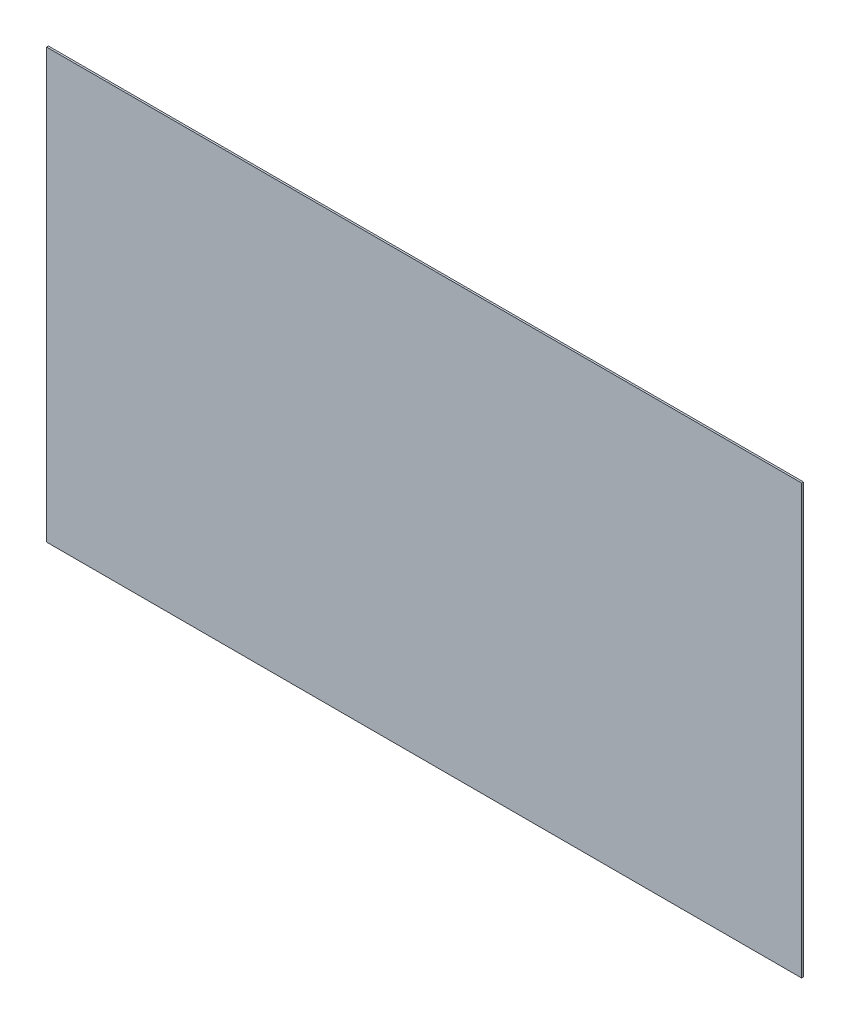
ISO-10303-21;
HEADER;
FILE_DESCRIPTION(('STEP AP214'),'2;1');
FILE_NAME('part.step','',(''),(''),'','','');
FILE_SCHEMA(('AUTOMOTIVE_DESIGN { 1 0 10303 214 1 1 1 1 }'));
ENDSEC;
DATA;
#1=APPLICATION_CONTEXT('core data for automotive mechanical design processes');
#2=APPLICATION_PROTOCOL_DEFINITION('international standard','automotive_design',2000,#1);
#3=PRODUCT_CONTEXT('',#1,'mechanical');
#4=PRODUCT('Part','Part','',(#3));
#5=PRODUCT_RELATED_PRODUCT_CATEGORY('part','',(#4));
#6=PRODUCT_DEFINITION_FORMATION('','',#4);
#7=PRODUCT_DEFINITION_CONTEXT('part definition',#1,'design');
#8=PRODUCT_DEFINITION('design','',#6,#7);
#9=PRODUCT_DEFINITION_SHAPE('','',#8);
#10=(LENGTH_UNIT() NAMED_UNIT(*) SI_UNIT(.MILLI.,.METRE.));
#11=(NAMED_UNIT(*) PLANE_ANGLE_UNIT() SI_UNIT($,.RADIAN.));
#12=(NAMED_UNIT(*) SI_UNIT($,.STERADIAN.) SOLID_ANGLE_UNIT());
#13=UNCERTAINTY_MEASURE_WITH_UNIT(LENGTH_MEASURE(1.E-05),#10,'distance_accuracy_value','');
#14=(GEOMETRIC_REPRESENTATION_CONTEXT(3) GLOBAL_UNCERTAINTY_ASSIGNED_CONTEXT((#13)) GLOBAL_UNIT_ASSIGNED_CONTEXT((#10,
#11,#12)) REPRESENTATION_CONTEXT('',''));
#15=CARTESIAN_POINT('',(0.,0.,0.));
#16=DIRECTION('',(0.,0.,1.));
#17=DIRECTION('',(1.,0.,0.));
#18=AXIS2_PLACEMENT_3D('',#15,#16,#17);
#19=CARTESIAN_POINT('',(0.,0.,4.));
#20=DIRECTION('',(0.,0.,1.));
#21=DIRECTION('',(1.,0.,0.));
#22=AXIS2_PLACEMENT_3D('',#19,#20,#21);
#23=PLANE('',#22);
#24=DIRECTION('',(-1.,0.,0.));
#25=VECTOR('',#24,1.);
#26=CARTESIAN_POINT('',(-400000.,-23.0000000000814,4.));
#27=LINE('',#26,#25);
#28=CARTESIAN_POINT('',(40.5000000000215,-23.0000000000246,4.));
#29=VERTEX_POINT('',#28);
#30=CARTESIAN_POINT('',(-40.4999999999958,-23.0000000000246,4.));
#31=VERTEX_POINT('',#30);
#32=EDGE_CURVE('E41',#29,#31,#27,.T.);
#33=ORIENTED_EDGE('',*,*,#32,.F.);
#34=DIRECTION('',(0.,-1.,0.));
#35=VECTOR('',#34,1.);
#36=CARTESIAN_POINT('',(40.5000000000655,-291545.,4.));
#37=LINE('',#36,#35);
#38=CARTESIAN_POINT('',(40.5000000000655,23.0000000000191,4.));
#39=VERTEX_POINT('',#38);
#40=EDGE_CURVE('E64',#39,#29,#37,.T.);
#41=ORIENTED_EDGE('',*,*,#40,.F.);
#42=DIRECTION('',(1.,0.,0.));
#43=VECTOR('',#42,1.);
#44=CARTESIAN_POINT('',(-400000.,22.9999999999677,4.));
#45=LINE('',#44,#43);
#46=CARTESIAN_POINT('',(-40.5000000000086,23.0000000000191,4.));
#47=VERTEX_POINT('',#46);
#48=EDGE_CURVE('E69',#47,#39,#45,.T.);
#49=ORIENTED_EDGE('',*,*,#48,.F.);
#50=DIRECTION('',(0.,1.,0.));
#51=VECTOR('',#50,1.);
#52=CARTESIAN_POINT('',(-40.4999999999518,-291545.,4.));
#53=LINE('',#52,#51);
#54=EDGE_CURVE('E84',#31,#47,#53,.T.);
#55=ORIENTED_EDGE('',*,*,#54,.F.);
#56=EDGE_LOOP('',(#33,#41,#49,#55));
#57=FACE_BOUND('',#56,.T.);
#58=ADVANCED_FACE('F33',(#57),#23,.T.);
#59=CARTESIAN_POINT('',(0.,0.,3.8));
#60=DIRECTION('',(0.,0.,-1.));
#61=DIRECTION('',(-1.,0.,0.));
#62=AXIS2_PLACEMENT_3D('',#59,#60,#61);
#63=PLANE('',#62);
#64=DIRECTION('',(-1.,0.,0.));
#65=VECTOR('',#64,1.);
#66=CARTESIAN_POINT('',(-400000.,-23.0000000000814,3.8));
#67=LINE('',#66,#65);
#68=CARTESIAN_POINT('',(40.5000000000215,-23.0000000000246,3.8));
#69=VERTEX_POINT('',#68);
#70=CARTESIAN_POINT('',(-40.4999999999958,-23.0000000000246,3.8));
#71=VERTEX_POINT('',#70);
#72=EDGE_CURVE('E93',#69,#71,#67,.T.);
#73=ORIENTED_EDGE('',*,*,#72,.T.);
#74=DIRECTION('',(0.,1.,0.));
#75=VECTOR('',#74,1.);
#76=CARTESIAN_POINT('',(-40.4999999999518,-291545.,3.8));
#77=LINE('',#76,#75);
#78=CARTESIAN_POINT('',(-40.5000000000086,23.0000000000191,3.8));
#79=VERTEX_POINT('',#78);
#80=EDGE_CURVE('E82',#71,#79,#77,.T.);
#81=ORIENTED_EDGE('',*,*,#80,.T.);
#82=DIRECTION('',(1.,0.,0.));
#83=VECTOR('',#82,1.);
#84=CARTESIAN_POINT('',(-400000.,22.9999999999677,3.8));
#85=LINE('',#84,#83);
#86=CARTESIAN_POINT('',(40.5000000000215,23.0000000000246,3.8));
#87=VERTEX_POINT('',#86);
#88=EDGE_CURVE('E85',#79,#87,#85,.T.);
#89=ORIENTED_EDGE('',*,*,#88,.T.);
#90=DIRECTION('',(0.,-1.,0.));
#91=VECTOR('',#90,1.);
#92=CARTESIAN_POINT('',(40.5000000000655,-291545.,3.8));
#93=LINE('',#92,#91);
#94=EDGE_CURVE('E90',#87,#69,#93,.T.);
#95=ORIENTED_EDGE('',*,*,#94,.T.);
#96=EDGE_LOOP('',(#73,#81,#89,#95));
#97=FACE_BOUND('',#96,.T.);
#98=ADVANCED_FACE('F92',(#97),#63,.T.);
#99=CARTESIAN_POINT('',(-40.4999999999518,-291545.,97.1504159948274));
#100=DIRECTION('',(-1.,0.,0.));
#101=DIRECTION('',(0.,-1.,0.));
#102=AXIS2_PLACEMENT_3D('',#99,#100,#101);
#103=PLANE('',#102);
#104=DIRECTION('',(0.,0.,-1.));
#105=VECTOR('',#104,1.);
#106=CARTESIAN_POINT('',(-40.4999999999958,-23.0000000000246,97.1504159948274));
#107=LINE('',#106,#105);
#108=EDGE_CURVE('E11',#31,#71,#107,.T.);
#109=ORIENTED_EDGE('',*,*,#108,.F.);
#110=ORIENTED_EDGE('',*,*,#54,.T.);
#111=DIRECTION('',(0.,0.,-1.));
#112=VECTOR('',#111,1.);
#113=CARTESIAN_POINT('',(-40.5000000000086,23.0000000000191,97.1504159948274));
#114=LINE('',#113,#112);
#115=EDGE_CURVE('E79',#47,#79,#114,.T.);
#116=ORIENTED_EDGE('',*,*,#115,.T.);
#117=ORIENTED_EDGE('',*,*,#80,.F.);
#118=EDGE_LOOP('',(#109,#110,#116,#117));
#119=FACE_BOUND('',#118,.T.);
#120=ADVANCED_FACE('F80',(#119),#103,.T.);
#121=CARTESIAN_POINT('',(-400000.,22.9999999999677,97.1504159948274));
#122=DIRECTION('',(0.,1.,0.));
#123=DIRECTION('',(-1.,0.,0.));
#124=AXIS2_PLACEMENT_3D('',#121,#122,#123);
#125=PLANE('',#124);
#126=ORIENTED_EDGE('',*,*,#115,.F.);
#127=ORIENTED_EDGE('',*,*,#48,.T.);
#128=DIRECTION('',(0.,0.,-1.));
#129=VECTOR('',#128,1.);
#130=CARTESIAN_POINT('',(40.5000000000215,23.0000000000246,97.1504159948274));
#131=LINE('',#130,#129);
#132=EDGE_CURVE('E74',#39,#87,#131,.T.);
#133=ORIENTED_EDGE('',*,*,#132,.T.);
#134=ORIENTED_EDGE('',*,*,#88,.F.);
#135=EDGE_LOOP('',(#126,#127,#133,#134));
#136=FACE_BOUND('',#135,.T.);
#137=ADVANCED_FACE('F86',(#136),#125,.T.);
#138=CARTESIAN_POINT('',(40.5000000000655,-291545.,97.1504159948274));
#139=DIRECTION('',(1.,0.,0.));
#140=DIRECTION('',(0.,1.,0.));
#141=AXIS2_PLACEMENT_3D('',#138,#139,#140);
#142=PLANE('',#141);
#143=ORIENTED_EDGE('',*,*,#132,.F.);
#144=ORIENTED_EDGE('',*,*,#40,.T.);
#145=DIRECTION('',(0.,0.,-1.));
#146=VECTOR('',#145,1.);
#147=CARTESIAN_POINT('',(40.5000000000215,-23.0000000000246,97.1504159948274));
#148=LINE('',#147,#146);
#149=EDGE_CURVE('E100',#29,#69,#148,.T.);
#150=ORIENTED_EDGE('',*,*,#149,.T.);
#151=ORIENTED_EDGE('',*,*,#94,.F.);
#152=EDGE_LOOP('',(#143,#144,#150,#151));
#153=FACE_BOUND('',#152,.T.);
#154=ADVANCED_FACE('F106',(#153),#142,.T.);
#155=CARTESIAN_POINT('',(-400000.,-23.0000000000814,97.1504159948274));
#156=DIRECTION('',(0.,-1.,0.));
#157=DIRECTION('',(1.,0.,0.));
#158=AXIS2_PLACEMENT_3D('',#155,#156,#157);
#159=PLANE('',#158);
#160=ORIENTED_EDGE('',*,*,#149,.F.);
#161=ORIENTED_EDGE('',*,*,#32,.T.);
#162=ORIENTED_EDGE('',*,*,#108,.T.);
#163=ORIENTED_EDGE('',*,*,#72,.F.);
#164=EDGE_LOOP('',(#160,#161,#162,#163));
#165=FACE_BOUND('',#164,.T.);
#166=ADVANCED_FACE('F107',(#165),#159,.T.);
#167=CLOSED_SHELL('',(#58,#98,#120,#137,#154,#166));
#168=MANIFOLD_SOLID_BREP('B2',#167);
#169=ADVANCED_BREP_SHAPE_REPRESENTATION('',(#18,#168),#14);
#170=SHAPE_DEFINITION_REPRESENTATION(#9,#169);
ENDSEC;
END-ISO-10303-21;
